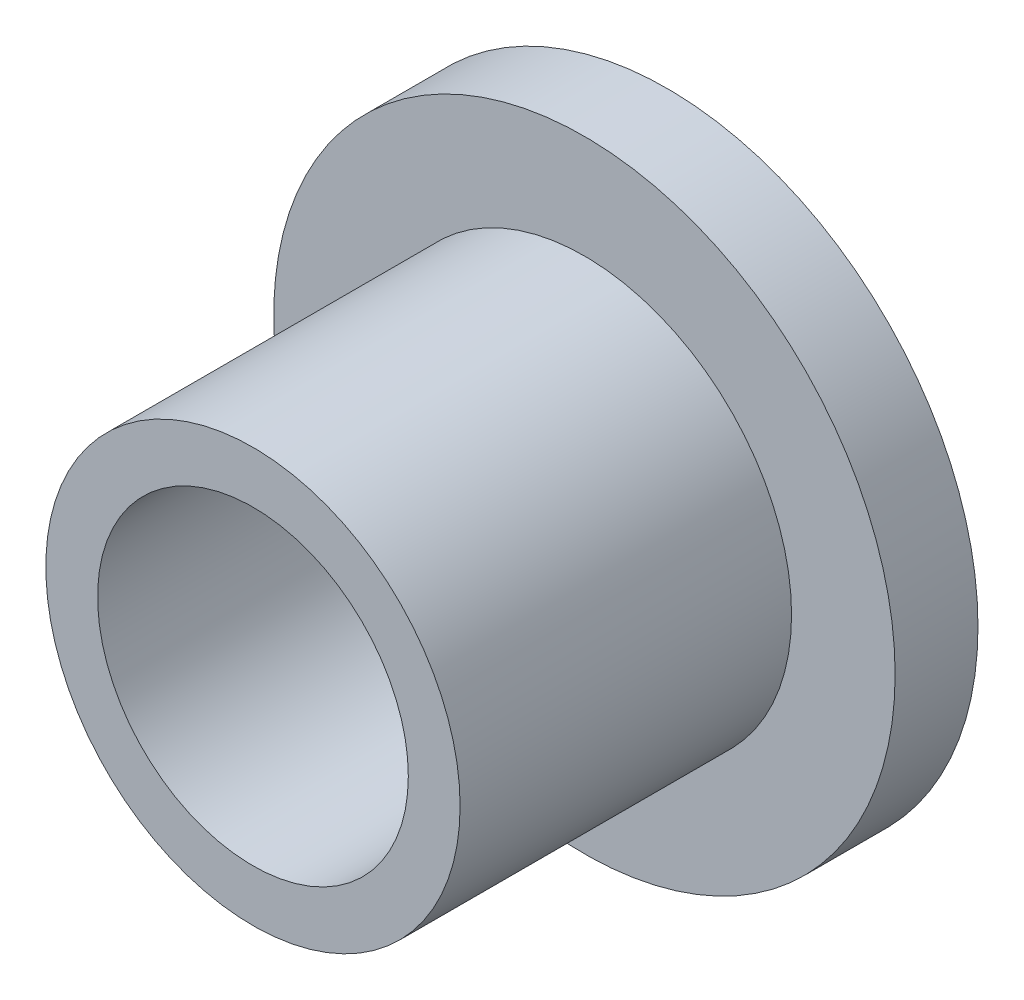
ISO-10303-21;
HEADER;
FILE_DESCRIPTION(('STEP AP214'),'2;1');
FILE_NAME('part.step','',(''),(''),'','','');
FILE_SCHEMA(('AUTOMOTIVE_DESIGN { 1 0 10303 214 1 1 1 1 }'));
ENDSEC;
DATA;
#1=APPLICATION_CONTEXT('core data for automotive mechanical design processes');
#2=APPLICATION_PROTOCOL_DEFINITION('international standard','automotive_design',2000,#1);
#3=PRODUCT_CONTEXT('',#1,'mechanical');
#4=PRODUCT('Part','Part','',(#3));
#5=PRODUCT_RELATED_PRODUCT_CATEGORY('part','',(#4));
#6=PRODUCT_DEFINITION_FORMATION('','',#4);
#7=PRODUCT_DEFINITION_CONTEXT('part definition',#1,'design');
#8=PRODUCT_DEFINITION('design','',#6,#7);
#9=PRODUCT_DEFINITION_SHAPE('','',#8);
#10=(LENGTH_UNIT() NAMED_UNIT(*) SI_UNIT(.MILLI.,.METRE.));
#11=(NAMED_UNIT(*) PLANE_ANGLE_UNIT() SI_UNIT($,.RADIAN.));
#12=(NAMED_UNIT(*) SI_UNIT($,.STERADIAN.) SOLID_ANGLE_UNIT());
#13=UNCERTAINTY_MEASURE_WITH_UNIT(LENGTH_MEASURE(1.E-05),#10,'distance_accuracy_value','');
#14=(GEOMETRIC_REPRESENTATION_CONTEXT(3) GLOBAL_UNCERTAINTY_ASSIGNED_CONTEXT((#13)) GLOBAL_UNIT_ASSIGNED_CONTEXT((#10,
#11,#12)) REPRESENTATION_CONTEXT('',''));
#15=CARTESIAN_POINT('',(0.,0.,0.));
#16=DIRECTION('',(0.,0.,1.));
#17=DIRECTION('',(1.,0.,0.));
#18=AXIS2_PLACEMENT_3D('',#15,#16,#17);
#19=CARTESIAN_POINT('',(0.,0.,2.54));
#20=DIRECTION('',(0.,0.,1.));
#21=DIRECTION('',(1.,0.,0.));
#22=AXIS2_PLACEMENT_3D('',#19,#20,#21);
#23=PLANE('',#22);
#24=CARTESIAN_POINT('',(0.,0.,2.54));
#25=DIRECTION('',(0.,0.,1.));
#26=DIRECTION('',(1.,0.,0.));
#27=AXIS2_PLACEMENT_3D('',#24,#25,#26);
#28=CIRCLE('',#27,9.525);
#29=CARTESIAN_POINT('',(9.525,0.,2.54));
#30=VERTEX_POINT('',#29);
#31=EDGE_CURVE('E10',#30,#30,#28,.T.);
#32=ORIENTED_EDGE('',*,*,#31,.T.);
#33=EDGE_LOOP('',(#32));
#34=FACE_BOUND('',#33,.T.);
#35=CARTESIAN_POINT('',(0.,0.,2.54));
#36=DIRECTION('',(0.,0.,1.));
#37=DIRECTION('',(1.,0.,0.));
#38=AXIS2_PLACEMENT_3D('',#35,#36,#37);
#39=CIRCLE('',#38,6.35);
#40=CARTESIAN_POINT('',(6.35,0.,2.54));
#41=VERTEX_POINT('',#40);
#42=EDGE_CURVE('E45',#41,#41,#39,.T.);
#43=ORIENTED_EDGE('',*,*,#42,.F.);
#44=EDGE_LOOP('',(#43));
#45=FACE_BOUND('',#44,.T.);
#46=ADVANCED_FACE('F32',(#34,#45),#23,.T.);
#47=CARTESIAN_POINT('',(0.,0.,2.54));
#48=DIRECTION('',(0.,0.,-1.));
#49=DIRECTION('',(-1.,0.,0.));
#50=AXIS2_PLACEMENT_3D('',#47,#48,#49);
#51=CYLINDRICAL_SURFACE('',#50,9.525);
#52=ORIENTED_EDGE('',*,*,#31,.F.);
#53=EDGE_LOOP('',(#52));
#54=FACE_BOUND('',#53,.T.);
#55=CARTESIAN_POINT('',(0.,0.,0.));
#56=DIRECTION('',(0.,0.,1.));
#57=DIRECTION('',(1.,0.,0.));
#58=AXIS2_PLACEMENT_3D('',#55,#56,#57);
#59=CIRCLE('',#58,9.525);
#60=CARTESIAN_POINT('',(9.525,0.,0.));
#61=VERTEX_POINT('',#60);
#62=EDGE_CURVE('E36',#61,#61,#59,.T.);
#63=ORIENTED_EDGE('',*,*,#62,.T.);
#64=EDGE_LOOP('',(#63));
#65=FACE_BOUND('',#64,.T.);
#66=ADVANCED_FACE('F34',(#54,#65),#51,.T.);
#67=CARTESIAN_POINT('',(0.,0.,0.));
#68=DIRECTION('',(0.,0.,1.));
#69=DIRECTION('',(1.,0.,0.));
#70=AXIS2_PLACEMENT_3D('',#67,#68,#69);
#71=PLANE('',#70);
#72=CARTESIAN_POINT('',(0.,0.,0.));
#73=DIRECTION('',(0.,0.,1.));
#74=DIRECTION('',(1.,0.,0.));
#75=AXIS2_PLACEMENT_3D('',#72,#73,#74);
#76=CIRCLE('',#75,4.7625);
#77=CARTESIAN_POINT('',(4.7625,0.,0.));
#78=VERTEX_POINT('',#77);
#79=EDGE_CURVE('E48',#78,#78,#76,.T.);
#80=ORIENTED_EDGE('',*,*,#79,.T.);
#81=EDGE_LOOP('',(#80));
#82=FACE_BOUND('',#81,.T.);
#83=ORIENTED_EDGE('',*,*,#62,.F.);
#84=EDGE_LOOP('',(#83));
#85=FACE_BOUND('',#84,.T.);
#86=ADVANCED_FACE('F69',(#82,#85),#71,.F.);
#87=CARTESIAN_POINT('',(0.,0.,12.7));
#88=DIRECTION('',(0.,0.,-1.));
#89=DIRECTION('',(-1.,0.,0.));
#90=AXIS2_PLACEMENT_3D('',#87,#88,#89);
#91=CYLINDRICAL_SURFACE('',#90,6.35);
#92=CARTESIAN_POINT('',(0.,0.,12.7));
#93=DIRECTION('',(0.,0.,1.));
#94=DIRECTION('',(1.,0.,0.));
#95=AXIS2_PLACEMENT_3D('',#92,#93,#94);
#96=CIRCLE('',#95,6.35);
#97=CARTESIAN_POINT('',(6.35,0.,12.7));
#98=VERTEX_POINT('',#97);
#99=EDGE_CURVE('E43',#98,#98,#96,.T.);
#100=ORIENTED_EDGE('',*,*,#99,.F.);
#101=EDGE_LOOP('',(#100));
#102=FACE_BOUND('',#101,.T.);
#103=ORIENTED_EDGE('',*,*,#42,.T.);
#104=EDGE_LOOP('',(#103));
#105=FACE_BOUND('',#104,.T.);
#106=ADVANCED_FACE('F63',(#102,#105),#91,.T.);
#107=CARTESIAN_POINT('',(0.,0.,12.7));
#108=DIRECTION('',(0.,0.,1.));
#109=DIRECTION('',(1.,0.,0.));
#110=AXIS2_PLACEMENT_3D('',#107,#108,#109);
#111=PLANE('',#110);
#112=CARTESIAN_POINT('',(0.,0.,12.7));
#113=DIRECTION('',(0.,0.,1.));
#114=DIRECTION('',(1.,0.,0.));
#115=AXIS2_PLACEMENT_3D('',#112,#113,#114);
#116=CIRCLE('',#115,4.7625);
#117=CARTESIAN_POINT('',(4.7625,0.,12.7));
#118=VERTEX_POINT('',#117);
#119=EDGE_CURVE('E53',#118,#118,#116,.T.);
#120=ORIENTED_EDGE('',*,*,#119,.F.);
#121=EDGE_LOOP('',(#120));
#122=FACE_BOUND('',#121,.T.);
#123=ORIENTED_EDGE('',*,*,#99,.T.);
#124=EDGE_LOOP('',(#123));
#125=FACE_BOUND('',#124,.T.);
#126=ADVANCED_FACE('F60',(#122,#125),#111,.T.);
#127=CARTESIAN_POINT('',(0.,0.,-12.7));
#128=DIRECTION('',(0.,0.,1.));
#129=DIRECTION('',(1.,0.,0.));
#130=AXIS2_PLACEMENT_3D('',#127,#128,#129);
#131=CYLINDRICAL_SURFACE('',#130,4.7625);
#132=ORIENTED_EDGE('',*,*,#119,.T.);
#133=EDGE_LOOP('',(#132));
#134=FACE_BOUND('',#133,.T.);
#135=ORIENTED_EDGE('',*,*,#79,.F.);
#136=EDGE_LOOP('',(#135));
#137=FACE_BOUND('',#136,.T.);
#138=ADVANCED_FACE('F57',(#134,#137),#131,.F.);
#139=CLOSED_SHELL('',(#46,#66,#86,#106,#126,#138));
#140=MANIFOLD_SOLID_BREP('B2',#139);
#141=ADVANCED_BREP_SHAPE_REPRESENTATION('',(#18,#140),#14);
#142=SHAPE_DEFINITION_REPRESENTATION(#9,#141);
ENDSEC;
END-ISO-10303-21;
